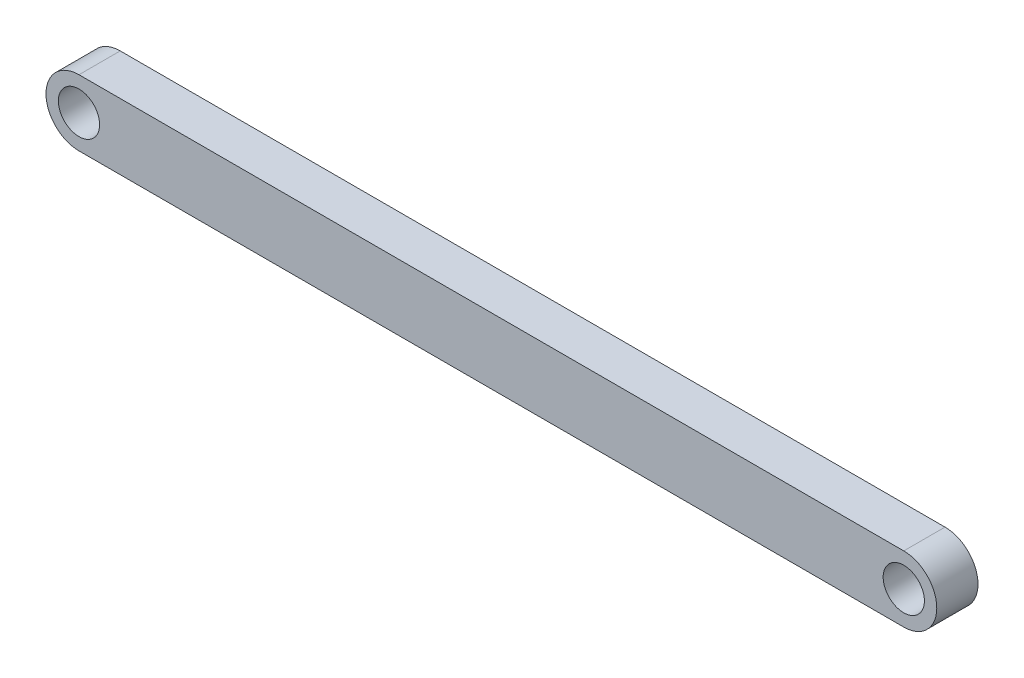
ISO-10303-21;
HEADER;
FILE_DESCRIPTION(('STEP AP214'),'2;1');
FILE_NAME('part.step','',(''),(''),'','','');
FILE_SCHEMA(('AUTOMOTIVE_DESIGN { 1 0 10303 214 1 1 1 1 }'));
ENDSEC;
DATA;
#1=APPLICATION_CONTEXT('core data for automotive mechanical design processes');
#2=APPLICATION_PROTOCOL_DEFINITION('international standard','automotive_design',2000,#1);
#3=PRODUCT_CONTEXT('',#1,'mechanical');
#4=PRODUCT('Part','Part','',(#3));
#5=PRODUCT_RELATED_PRODUCT_CATEGORY('part','',(#4));
#6=PRODUCT_DEFINITION_FORMATION('','',#4);
#7=PRODUCT_DEFINITION_CONTEXT('part definition',#1,'design');
#8=PRODUCT_DEFINITION('design','',#6,#7);
#9=PRODUCT_DEFINITION_SHAPE('','',#8);
#10=(LENGTH_UNIT() NAMED_UNIT(*) SI_UNIT(.MILLI.,.METRE.));
#11=(NAMED_UNIT(*) PLANE_ANGLE_UNIT() SI_UNIT($,.RADIAN.));
#12=(NAMED_UNIT(*) SI_UNIT($,.STERADIAN.) SOLID_ANGLE_UNIT());
#13=UNCERTAINTY_MEASURE_WITH_UNIT(LENGTH_MEASURE(1.E-05),#10,'distance_accuracy_value','');
#14=(GEOMETRIC_REPRESENTATION_CONTEXT(3) GLOBAL_UNCERTAINTY_ASSIGNED_CONTEXT((#13)) GLOBAL_UNIT_ASSIGNED_CONTEXT((#10,
#11,#12)) REPRESENTATION_CONTEXT('',''));
#15=CARTESIAN_POINT('',(0.,0.,0.));
#16=DIRECTION('',(0.,0.,1.));
#17=DIRECTION('',(1.,0.,0.));
#18=AXIS2_PLACEMENT_3D('',#15,#16,#17);
#19=CARTESIAN_POINT('',(0.,0.,5.));
#20=DIRECTION('',(0.,0.,1.));
#21=DIRECTION('',(1.,0.,0.));
#22=AXIS2_PLACEMENT_3D('',#19,#20,#21);
#23=PLANE('',#22);
#24=CARTESIAN_POINT('',(0.,0.,5.));
#25=DIRECTION('',(0.,0.,1.));
#26=DIRECTION('',(1.,0.,0.));
#27=AXIS2_PLACEMENT_3D('',#24,#25,#26);
#28=CIRCLE('',#27,2.5);
#29=CARTESIAN_POINT('',(2.5,0.,5.));
#30=VERTEX_POINT('',#29);
#31=EDGE_CURVE('E112',#30,#30,#28,.T.);
#32=ORIENTED_EDGE('',*,*,#31,.F.);
#33=EDGE_LOOP('',(#32));
#34=FACE_BOUND('',#33,.T.);
#35=CARTESIAN_POINT('',(0.,0.,5.));
#36=DIRECTION('',(0.,0.,1.));
#37=DIRECTION('',(1.,0.,0.));
#38=AXIS2_PLACEMENT_3D('',#35,#36,#37);
#39=CIRCLE('',#38,4.);
#40=CARTESIAN_POINT('',(0.,4.,5.));
#41=VERTEX_POINT('',#40);
#42=CARTESIAN_POINT('',(0.,-4.,5.));
#43=VERTEX_POINT('',#42);
#44=EDGE_CURVE('E92',#41,#43,#39,.T.);
#45=ORIENTED_EDGE('',*,*,#44,.T.);
#46=DIRECTION('',(1.,0.,0.));
#47=VECTOR('',#46,1.);
#48=CARTESIAN_POINT('',(100.,-3.99999999999997,5.));
#49=LINE('',#48,#47);
#50=CARTESIAN_POINT('',(100.,-3.99999999999998,5.));
#51=VERTEX_POINT('',#50);
#52=EDGE_CURVE('E87',#43,#51,#49,.T.);
#53=ORIENTED_EDGE('',*,*,#52,.T.);
#54=CARTESIAN_POINT('',(100.,0.,5.));
#55=DIRECTION('',(0.,0.,1.));
#56=DIRECTION('',(-1.,0.,0.));
#57=AXIS2_PLACEMENT_3D('',#54,#55,#56);
#58=CIRCLE('',#57,4.);
#59=CARTESIAN_POINT('',(100.,4.00000000000003,5.));
#60=VERTEX_POINT('',#59);
#61=EDGE_CURVE('E90',#51,#60,#58,.T.);
#62=ORIENTED_EDGE('',*,*,#61,.T.);
#63=DIRECTION('',(-1.,0.,0.));
#64=VECTOR('',#63,1.);
#65=CARTESIAN_POINT('',(100.,4.00000000000003,5.));
#66=LINE('',#65,#64);
#67=EDGE_CURVE('E57',#60,#41,#66,.T.);
#68=ORIENTED_EDGE('',*,*,#67,.T.);
#69=EDGE_LOOP('',(#45,#53,#62,#68));
#70=FACE_BOUND('',#69,.T.);
#71=CARTESIAN_POINT('',(100.,0.,5.));
#72=DIRECTION('',(0.,0.,1.));
#73=DIRECTION('',(1.,0.,0.));
#74=AXIS2_PLACEMENT_3D('',#71,#72,#73);
#75=CIRCLE('',#74,2.5);
#76=CARTESIAN_POINT('',(102.5,0.,5.));
#77=VERTEX_POINT('',#76);
#78=EDGE_CURVE('E134',#77,#77,#75,.T.);
#79=ORIENTED_EDGE('',*,*,#78,.F.);
#80=EDGE_LOOP('',(#79));
#81=FACE_BOUND('',#80,.T.);
#82=ADVANCED_FACE('F39',(#34,#70,#81),#23,.T.);
#83=CARTESIAN_POINT('',(0.,0.,0.));
#84=DIRECTION('',(0.,0.,1.));
#85=DIRECTION('',(1.,0.,0.));
#86=AXIS2_PLACEMENT_3D('',#83,#84,#85);
#87=PLANE('',#86);
#88=CARTESIAN_POINT('',(0.,0.,0.));
#89=DIRECTION('',(0.,0.,1.));
#90=DIRECTION('',(1.,0.,0.));
#91=AXIS2_PLACEMENT_3D('',#88,#89,#90);
#92=CIRCLE('',#91,4.);
#93=CARTESIAN_POINT('',(0.,4.,0.));
#94=VERTEX_POINT('',#93);
#95=CARTESIAN_POINT('',(0.,-4.,0.));
#96=VERTEX_POINT('',#95);
#97=EDGE_CURVE('E108',#94,#96,#92,.T.);
#98=ORIENTED_EDGE('',*,*,#97,.F.);
#99=DIRECTION('',(-1.,0.,0.));
#100=VECTOR('',#99,1.);
#101=CARTESIAN_POINT('',(100.,4.00000000000003,0.));
#102=LINE('',#101,#100);
#103=CARTESIAN_POINT('',(100.,4.00000000000003,0.));
#104=VERTEX_POINT('',#103);
#105=EDGE_CURVE('E80',#104,#94,#102,.T.);
#106=ORIENTED_EDGE('',*,*,#105,.F.);
#107=CARTESIAN_POINT('',(100.,0.,0.));
#108=DIRECTION('',(0.,0.,1.));
#109=DIRECTION('',(-1.,0.,0.));
#110=AXIS2_PLACEMENT_3D('',#107,#108,#109);
#111=CIRCLE('',#110,4.);
#112=CARTESIAN_POINT('',(100.,-3.99999999999998,0.));
#113=VERTEX_POINT('',#112);
#114=EDGE_CURVE('E74',#113,#104,#111,.T.);
#115=ORIENTED_EDGE('',*,*,#114,.F.);
#116=DIRECTION('',(1.,0.,0.));
#117=VECTOR('',#116,1.);
#118=CARTESIAN_POINT('',(100.,-3.99999999999997,0.));
#119=LINE('',#118,#117);
#120=EDGE_CURVE('E97',#96,#113,#119,.T.);
#121=ORIENTED_EDGE('',*,*,#120,.F.);
#122=EDGE_LOOP('',(#98,#106,#115,#121));
#123=FACE_BOUND('',#122,.T.);
#124=CARTESIAN_POINT('',(0.,0.,0.));
#125=DIRECTION('',(0.,0.,1.));
#126=DIRECTION('',(1.,0.,0.));
#127=AXIS2_PLACEMENT_3D('',#124,#125,#126);
#128=CIRCLE('',#127,2.5);
#129=CARTESIAN_POINT('',(2.5,0.,0.));
#130=VERTEX_POINT('',#129);
#131=EDGE_CURVE('E130',#130,#130,#128,.T.);
#132=ORIENTED_EDGE('',*,*,#131,.T.);
#133=EDGE_LOOP('',(#132));
#134=FACE_BOUND('',#133,.T.);
#135=CARTESIAN_POINT('',(100.,0.,0.));
#136=DIRECTION('',(0.,0.,1.));
#137=DIRECTION('',(1.,0.,0.));
#138=AXIS2_PLACEMENT_3D('',#135,#136,#137);
#139=CIRCLE('',#138,2.5);
#140=CARTESIAN_POINT('',(102.5,0.,0.));
#141=VERTEX_POINT('',#140);
#142=EDGE_CURVE('E138',#141,#141,#139,.T.);
#143=ORIENTED_EDGE('',*,*,#142,.T.);
#144=EDGE_LOOP('',(#143));
#145=FACE_BOUND('',#144,.T.);
#146=ADVANCED_FACE('F125',(#123,#134,#145),#87,.F.);
#147=CARTESIAN_POINT('',(0.,0.,5.));
#148=DIRECTION('',(0.,0.,-1.));
#149=DIRECTION('',(-1.,0.,0.));
#150=AXIS2_PLACEMENT_3D('',#147,#148,#149);
#151=CYLINDRICAL_SURFACE('',#150,4.);
#152=ORIENTED_EDGE('',*,*,#97,.T.);
#153=DIRECTION('',(0.,0.,-1.));
#154=VECTOR('',#153,1.);
#155=CARTESIAN_POINT('',(0.,-4.,5.));
#156=LINE('',#155,#154);
#157=EDGE_CURVE('E11',#43,#96,#156,.T.);
#158=ORIENTED_EDGE('',*,*,#157,.F.);
#159=ORIENTED_EDGE('',*,*,#44,.F.);
#160=DIRECTION('',(0.,0.,-1.));
#161=VECTOR('',#160,1.);
#162=CARTESIAN_POINT('',(0.,4.,5.));
#163=LINE('',#162,#161);
#164=EDGE_CURVE('E104',#41,#94,#163,.T.);
#165=ORIENTED_EDGE('',*,*,#164,.T.);
#166=EDGE_LOOP('',(#152,#158,#159,#165));
#167=FACE_BOUND('',#166,.T.);
#168=ADVANCED_FACE('F41',(#167),#151,.T.);
#169=CARTESIAN_POINT('',(100.,-3.99999999999997,5.));
#170=DIRECTION('',(0.,1.,0.));
#171=DIRECTION('',(-1.,0.,0.));
#172=AXIS2_PLACEMENT_3D('',#169,#170,#171);
#173=PLANE('',#172);
#174=ORIENTED_EDGE('',*,*,#120,.T.);
#175=DIRECTION('',(0.,0.,-1.));
#176=VECTOR('',#175,1.);
#177=CARTESIAN_POINT('',(100.,-3.99999999999998,5.));
#178=LINE('',#177,#176);
#179=EDGE_CURVE('E49',#51,#113,#178,.T.);
#180=ORIENTED_EDGE('',*,*,#179,.F.);
#181=ORIENTED_EDGE('',*,*,#52,.F.);
#182=ORIENTED_EDGE('',*,*,#157,.T.);
#183=EDGE_LOOP('',(#174,#180,#181,#182));
#184=FACE_BOUND('',#183,.T.);
#185=ADVANCED_FACE('F96',(#184),#173,.F.);
#186=CARTESIAN_POINT('',(100.,0.,5.));
#187=DIRECTION('',(0.,0.,-1.));
#188=DIRECTION('',(-1.,0.,0.));
#189=AXIS2_PLACEMENT_3D('',#186,#187,#188);
#190=CYLINDRICAL_SURFACE('',#189,4.);
#191=ORIENTED_EDGE('',*,*,#114,.T.);
#192=DIRECTION('',(0.,0.,-1.));
#193=VECTOR('',#192,1.);
#194=CARTESIAN_POINT('',(100.,4.00000000000003,5.));
#195=LINE('',#194,#193);
#196=EDGE_CURVE('E99',#60,#104,#195,.T.);
#197=ORIENTED_EDGE('',*,*,#196,.F.);
#198=ORIENTED_EDGE('',*,*,#61,.F.);
#199=ORIENTED_EDGE('',*,*,#179,.T.);
#200=EDGE_LOOP('',(#191,#197,#198,#199));
#201=FACE_BOUND('',#200,.T.);
#202=ADVANCED_FACE('F100',(#201),#190,.T.);
#203=CARTESIAN_POINT('',(100.,4.00000000000003,5.));
#204=DIRECTION('',(0.,-1.,0.));
#205=DIRECTION('',(1.,0.,0.));
#206=AXIS2_PLACEMENT_3D('',#203,#204,#205);
#207=PLANE('',#206);
#208=ORIENTED_EDGE('',*,*,#105,.T.);
#209=ORIENTED_EDGE('',*,*,#164,.F.);
#210=ORIENTED_EDGE('',*,*,#67,.F.);
#211=ORIENTED_EDGE('',*,*,#196,.T.);
#212=EDGE_LOOP('',(#208,#209,#210,#211));
#213=FACE_BOUND('',#212,.T.);
#214=ADVANCED_FACE('F122',(#213),#207,.F.);
#215=CARTESIAN_POINT('',(0.,0.,5.));
#216=DIRECTION('',(0.,0.,-1.));
#217=DIRECTION('',(-1.,0.,0.));
#218=AXIS2_PLACEMENT_3D('',#215,#216,#217);
#219=CYLINDRICAL_SURFACE('',#218,2.5);
#220=ORIENTED_EDGE('',*,*,#31,.T.);
#221=EDGE_LOOP('',(#220));
#222=FACE_BOUND('',#221,.T.);
#223=ORIENTED_EDGE('',*,*,#131,.F.);
#224=EDGE_LOOP('',(#223));
#225=FACE_BOUND('',#224,.T.);
#226=ADVANCED_FACE('F157',(#222,#225),#219,.F.);
#227=CARTESIAN_POINT('',(100.,0.,5.));
#228=DIRECTION('',(0.,0.,-1.));
#229=DIRECTION('',(-1.,0.,0.));
#230=AXIS2_PLACEMENT_3D('',#227,#228,#229);
#231=CYLINDRICAL_SURFACE('',#230,2.5);
#232=ORIENTED_EDGE('',*,*,#78,.T.);
#233=EDGE_LOOP('',(#232));
#234=FACE_BOUND('',#233,.T.);
#235=ORIENTED_EDGE('',*,*,#142,.F.);
#236=EDGE_LOOP('',(#235));
#237=FACE_BOUND('',#236,.T.);
#238=ADVANCED_FACE('F146',(#234,#237),#231,.F.);
#239=CLOSED_SHELL('',(#82,#146,#168,#185,#202,#214,#226,#238));
#240=MANIFOLD_SOLID_BREP('B2',#239);
#241=ADVANCED_BREP_SHAPE_REPRESENTATION('',(#18,#240),#14);
#242=SHAPE_DEFINITION_REPRESENTATION(#9,#241);
ENDSEC;
END-ISO-10303-21;
